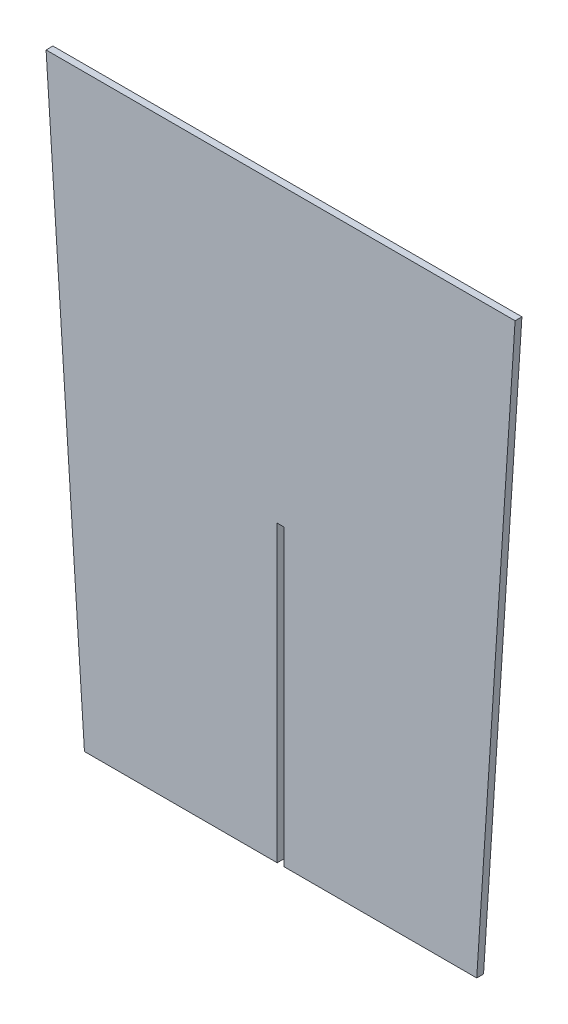
ISO-10303-21;
HEADER;
FILE_DESCRIPTION(('STEP AP214'),'2;1');
FILE_NAME('part.step','',(''),(''),'','','');
FILE_SCHEMA(('AUTOMOTIVE_DESIGN { 1 0 10303 214 1 1 1 1 }'));
ENDSEC;
DATA;
#1=APPLICATION_CONTEXT('core data for automotive mechanical design processes');
#2=APPLICATION_PROTOCOL_DEFINITION('international standard','automotive_design',2000,#1);
#3=PRODUCT_CONTEXT('',#1,'mechanical');
#4=PRODUCT('Part','Part','',(#3));
#5=PRODUCT_RELATED_PRODUCT_CATEGORY('part','',(#4));
#6=PRODUCT_DEFINITION_FORMATION('','',#4);
#7=PRODUCT_DEFINITION_CONTEXT('part definition',#1,'design');
#8=PRODUCT_DEFINITION('design','',#6,#7);
#9=PRODUCT_DEFINITION_SHAPE('','',#8);
#10=(LENGTH_UNIT() NAMED_UNIT(*) SI_UNIT(.MILLI.,.METRE.));
#11=(NAMED_UNIT(*) PLANE_ANGLE_UNIT() SI_UNIT($,.RADIAN.));
#12=(NAMED_UNIT(*) SI_UNIT($,.STERADIAN.) SOLID_ANGLE_UNIT());
#13=UNCERTAINTY_MEASURE_WITH_UNIT(LENGTH_MEASURE(1.E-05),#10,'distance_accuracy_value','');
#14=(GEOMETRIC_REPRESENTATION_CONTEXT(3) GLOBAL_UNCERTAINTY_ASSIGNED_CONTEXT((#13)) GLOBAL_UNIT_ASSIGNED_CONTEXT((#10,
#11,#12)) REPRESENTATION_CONTEXT('',''));
#15=CARTESIAN_POINT('',(0.,0.,0.));
#16=DIRECTION('',(0.,0.,1.));
#17=DIRECTION('',(1.,0.,0.));
#18=AXIS2_PLACEMENT_3D('',#15,#16,#17);
#19=CARTESIAN_POINT('',(0.,172.5,4.));
#20=DIRECTION('',(0.,1.,0.));
#21=DIRECTION('',(0.,0.,1.));
#22=AXIS2_PLACEMENT_3D('',#19,#20,#21);
#23=PLANE('',#22);
#24=DIRECTION('',(1.,0.,0.));
#25=VECTOR('',#24,1.);
#26=CARTESIAN_POINT('',(0.,172.5,0.));
#27=LINE('',#26,#25);
#28=CARTESIAN_POINT('',(113.,172.5,0.));
#29=VERTEX_POINT('',#28);
#30=CARTESIAN_POINT('',(117.,172.5,0.));
#31=VERTEX_POINT('',#30);
#32=EDGE_CURVE('E138',#29,#31,#27,.T.);
#33=ORIENTED_EDGE('',*,*,#32,.T.);
#34=DIRECTION('',(0.,0.,-1.));
#35=VECTOR('',#34,1.);
#36=CARTESIAN_POINT('',(117.,172.5,4.));
#37=LINE('',#36,#35);
#38=CARTESIAN_POINT('',(117.,172.5,4.));
#39=VERTEX_POINT('',#38);
#40=EDGE_CURVE('E11',#39,#31,#37,.T.);
#41=ORIENTED_EDGE('',*,*,#40,.F.);
#42=DIRECTION('',(1.,0.,0.));
#43=VECTOR('',#42,1.);
#44=CARTESIAN_POINT('',(0.,172.5,4.));
#45=LINE('',#44,#43);
#46=CARTESIAN_POINT('',(113.,172.5,4.));
#47=VERTEX_POINT('',#46);
#48=EDGE_CURVE('E154',#47,#39,#45,.T.);
#49=ORIENTED_EDGE('',*,*,#48,.F.);
#50=DIRECTION('',(0.,0.,-1.));
#51=VECTOR('',#50,1.);
#52=CARTESIAN_POINT('',(113.,172.5,4.));
#53=LINE('',#52,#51);
#54=EDGE_CURVE('E134',#47,#29,#53,.T.);
#55=ORIENTED_EDGE('',*,*,#54,.T.);
#56=EDGE_LOOP('',(#33,#41,#49,#55));
#57=FACE_BOUND('',#56,.T.);
#58=ADVANCED_FACE('F41',(#57),#23,.F.);
#59=CARTESIAN_POINT('',(117.,0.,4.));
#60=DIRECTION('',(1.,0.,0.));
#61=DIRECTION('',(0.,1.,0.));
#62=AXIS2_PLACEMENT_3D('',#59,#60,#61);
#63=PLANE('',#62);
#64=DIRECTION('',(0.,-1.,0.));
#65=VECTOR('',#64,1.);
#66=CARTESIAN_POINT('',(117.,0.,0.));
#67=LINE('',#66,#65);
#68=CARTESIAN_POINT('',(117.,0.,0.));
#69=VERTEX_POINT('',#68);
#70=EDGE_CURVE('E141',#31,#69,#67,.T.);
#71=ORIENTED_EDGE('',*,*,#70,.T.);
#72=DIRECTION('',(0.,0.,-1.));
#73=VECTOR('',#72,1.);
#74=CARTESIAN_POINT('',(117.,0.,4.));
#75=LINE('',#74,#73);
#76=CARTESIAN_POINT('',(117.,0.,4.));
#77=VERTEX_POINT('',#76);
#78=EDGE_CURVE('E49',#77,#69,#75,.T.);
#79=ORIENTED_EDGE('',*,*,#78,.F.);
#80=DIRECTION('',(0.,-1.,0.));
#81=VECTOR('',#80,1.);
#82=CARTESIAN_POINT('',(117.,0.,4.));
#83=LINE('',#82,#81);
#84=EDGE_CURVE('E100',#39,#77,#83,.T.);
#85=ORIENTED_EDGE('',*,*,#84,.F.);
#86=ORIENTED_EDGE('',*,*,#40,.T.);
#87=EDGE_LOOP('',(#71,#79,#85,#86));
#88=FACE_BOUND('',#87,.T.);
#89=ADVANCED_FACE('F184',(#88),#63,.F.);
#90=CARTESIAN_POINT('',(0.,0.,4.));
#91=DIRECTION('',(0.,1.,0.));
#92=DIRECTION('',(0.,0.,1.));
#93=AXIS2_PLACEMENT_3D('',#90,#91,#92);
#94=PLANE('',#93);
#95=DIRECTION('',(1.,0.,0.));
#96=VECTOR('',#95,1.);
#97=CARTESIAN_POINT('',(0.,0.,0.));
#98=LINE('',#97,#96);
#99=CARTESIAN_POINT('',(230.,0.,0.));
#100=VERTEX_POINT('',#99);
#101=EDGE_CURVE('E143',#69,#100,#98,.T.);
#102=ORIENTED_EDGE('',*,*,#101,.T.);
#103=DIRECTION('',(0.,0.,-1.));
#104=VECTOR('',#103,1.);
#105=CARTESIAN_POINT('',(230.,0.,4.));
#106=LINE('',#105,#104);
#107=CARTESIAN_POINT('',(230.,0.,4.));
#108=VERTEX_POINT('',#107);
#109=EDGE_CURVE('E160',#108,#100,#106,.T.);
#110=ORIENTED_EDGE('',*,*,#109,.F.);
#111=DIRECTION('',(1.,0.,0.));
#112=VECTOR('',#111,1.);
#113=CARTESIAN_POINT('',(0.,0.,4.));
#114=LINE('',#113,#112);
#115=EDGE_CURVE('E167',#77,#108,#114,.T.);
#116=ORIENTED_EDGE('',*,*,#115,.F.);
#117=ORIENTED_EDGE('',*,*,#78,.T.);
#118=EDGE_LOOP('',(#102,#110,#116,#117));
#119=FACE_BOUND('',#118,.T.);
#120=ADVANCED_FACE('F165',(#119),#94,.F.);
#121=CARTESIAN_POINT('',(229.025882352941,-14.9364705882353,4.));
#122=DIRECTION('',(0.997880105965818,-0.0650791373455969,0.));
#123=DIRECTION('',(0.0650791373455969,0.997880105965818,0.));
#124=AXIS2_PLACEMENT_3D('',#121,#122,#123);
#125=PLANE('',#124);
#126=DIRECTION('',(-0.0650791373455969,-0.997880105965818,0.));
#127=VECTOR('',#126,1.);
#128=CARTESIAN_POINT('',(229.025882352941,-14.9364705882353,0.));
#129=LINE('',#128,#127);
#130=CARTESIAN_POINT('',(252.5,345.,0.));
#131=VERTEX_POINT('',#130);
#132=EDGE_CURVE('E146',#131,#100,#129,.T.);
#133=ORIENTED_EDGE('',*,*,#132,.F.);
#134=DIRECTION('',(0.,0.,-1.));
#135=VECTOR('',#134,1.);
#136=CARTESIAN_POINT('',(252.5,345.,4.));
#137=LINE('',#136,#135);
#138=CARTESIAN_POINT('',(252.5,345.,4.));
#139=VERTEX_POINT('',#138);
#140=EDGE_CURVE('E158',#139,#131,#137,.T.);
#141=ORIENTED_EDGE('',*,*,#140,.F.);
#142=DIRECTION('',(-0.0650791373455969,-0.997880105965818,0.));
#143=VECTOR('',#142,1.);
#144=CARTESIAN_POINT('',(229.025882352941,-14.9364705882353,4.));
#145=LINE('',#144,#143);
#146=EDGE_CURVE('E176',#139,#108,#145,.T.);
#147=ORIENTED_EDGE('',*,*,#146,.T.);
#148=ORIENTED_EDGE('',*,*,#109,.T.);
#149=EDGE_LOOP('',(#133,#141,#147,#148));
#150=FACE_BOUND('',#149,.T.);
#151=ADVANCED_FACE('F174',(#150),#125,.T.);
#152=CARTESIAN_POINT('',(0.,345.,4.));
#153=DIRECTION('',(0.,-1.,0.));
#154=DIRECTION('',(0.,0.,-1.));
#155=AXIS2_PLACEMENT_3D('',#152,#153,#154);
#156=PLANE('',#155);
#157=DIRECTION('',(-1.,0.,0.));
#158=VECTOR('',#157,1.);
#159=CARTESIAN_POINT('',(0.,345.,0.));
#160=LINE('',#159,#158);
#161=CARTESIAN_POINT('',(-22.5,345.,0.));
#162=VERTEX_POINT('',#161);
#163=EDGE_CURVE('E149',#131,#162,#160,.T.);
#164=ORIENTED_EDGE('',*,*,#163,.T.);
#165=DIRECTION('',(0.,0.,-1.));
#166=VECTOR('',#165,1.);
#167=CARTESIAN_POINT('',(-22.5,345.,4.));
#168=LINE('',#167,#166);
#169=CARTESIAN_POINT('',(-22.5,345.,4.));
#170=VERTEX_POINT('',#169);
#171=EDGE_CURVE('E129',#170,#162,#168,.T.);
#172=ORIENTED_EDGE('',*,*,#171,.F.);
#173=DIRECTION('',(-1.,0.,0.));
#174=VECTOR('',#173,1.);
#175=CARTESIAN_POINT('',(0.,345.,4.));
#176=LINE('',#175,#174);
#177=EDGE_CURVE('E120',#139,#170,#176,.T.);
#178=ORIENTED_EDGE('',*,*,#177,.F.);
#179=ORIENTED_EDGE('',*,*,#140,.T.);
#180=EDGE_LOOP('',(#164,#172,#178,#179));
#181=FACE_BOUND('',#180,.T.);
#182=ADVANCED_FACE('F194',(#181),#156,.F.);
#183=CARTESIAN_POINT('',(0.,0.,4.));
#184=DIRECTION('',(0.997880105965818,0.0650791373455968,0.));
#185=DIRECTION('',(-0.0650791373455968,0.997880105965818,0.));
#186=AXIS2_PLACEMENT_3D('',#183,#184,#185);
#187=PLANE('',#186);
#188=DIRECTION('',(0.0650791373455968,-0.997880105965818,0.));
#189=VECTOR('',#188,1.);
#190=CARTESIAN_POINT('',(0.,0.,0.));
#191=LINE('',#190,#189);
#192=CARTESIAN_POINT('',(0.,0.,0.));
#193=VERTEX_POINT('',#192);
#194=EDGE_CURVE('E128',#162,#193,#191,.T.);
#195=ORIENTED_EDGE('',*,*,#194,.T.);
#196=DIRECTION('',(0.,0.,-1.));
#197=VECTOR('',#196,1.);
#198=CARTESIAN_POINT('',(0.,0.,4.));
#199=LINE('',#198,#197);
#200=CARTESIAN_POINT('',(0.,0.,4.));
#201=VERTEX_POINT('',#200);
#202=EDGE_CURVE('E125',#201,#193,#199,.T.);
#203=ORIENTED_EDGE('',*,*,#202,.F.);
#204=DIRECTION('',(0.0650791373455968,-0.997880105965818,0.));
#205=VECTOR('',#204,1.);
#206=CARTESIAN_POINT('',(0.,0.,4.));
#207=LINE('',#206,#205);
#208=EDGE_CURVE('E113',#170,#201,#207,.T.);
#209=ORIENTED_EDGE('',*,*,#208,.F.);
#210=ORIENTED_EDGE('',*,*,#171,.T.);
#211=EDGE_LOOP('',(#195,#203,#209,#210));
#212=FACE_BOUND('',#211,.T.);
#213=ADVANCED_FACE('F126',(#212),#187,.F.);
#214=CARTESIAN_POINT('',(0.,0.,4.));
#215=DIRECTION('',(0.,1.,0.));
#216=DIRECTION('',(0.,0.,1.));
#217=AXIS2_PLACEMENT_3D('',#214,#215,#216);
#218=PLANE('',#217);
#219=DIRECTION('',(1.,0.,0.));
#220=VECTOR('',#219,1.);
#221=CARTESIAN_POINT('',(0.,0.,0.));
#222=LINE('',#221,#220);
#223=CARTESIAN_POINT('',(113.,0.,0.));
#224=VERTEX_POINT('',#223);
#225=EDGE_CURVE('E86',#193,#224,#222,.T.);
#226=ORIENTED_EDGE('',*,*,#225,.T.);
#227=DIRECTION('',(0.,0.,-1.));
#228=VECTOR('',#227,1.);
#229=CARTESIAN_POINT('',(113.,0.,4.));
#230=LINE('',#229,#228);
#231=CARTESIAN_POINT('',(113.,0.,4.));
#232=VERTEX_POINT('',#231);
#233=EDGE_CURVE('E130',#232,#224,#230,.T.);
#234=ORIENTED_EDGE('',*,*,#233,.F.);
#235=DIRECTION('',(1.,0.,0.));
#236=VECTOR('',#235,1.);
#237=CARTESIAN_POINT('',(0.,0.,4.));
#238=LINE('',#237,#236);
#239=EDGE_CURVE('E117',#201,#232,#238,.T.);
#240=ORIENTED_EDGE('',*,*,#239,.F.);
#241=ORIENTED_EDGE('',*,*,#202,.T.);
#242=EDGE_LOOP('',(#226,#234,#240,#241));
#243=FACE_BOUND('',#242,.T.);
#244=ADVANCED_FACE('F132',(#243),#218,.F.);
#245=CARTESIAN_POINT('',(113.,0.,4.));
#246=DIRECTION('',(-1.,0.,0.));
#247=DIRECTION('',(0.,0.,1.));
#248=AXIS2_PLACEMENT_3D('',#245,#246,#247);
#249=PLANE('',#248);
#250=DIRECTION('',(0.,1.,0.));
#251=VECTOR('',#250,1.);
#252=CARTESIAN_POINT('',(113.,0.,0.));
#253=LINE('',#252,#251);
#254=EDGE_CURVE('E92',#224,#29,#253,.T.);
#255=ORIENTED_EDGE('',*,*,#254,.T.);
#256=ORIENTED_EDGE('',*,*,#54,.F.);
#257=DIRECTION('',(0.,1.,0.));
#258=VECTOR('',#257,1.);
#259=CARTESIAN_POINT('',(113.,0.,4.));
#260=LINE('',#259,#258);
#261=EDGE_CURVE('E57',#232,#47,#260,.T.);
#262=ORIENTED_EDGE('',*,*,#261,.F.);
#263=ORIENTED_EDGE('',*,*,#233,.T.);
#264=EDGE_LOOP('',(#255,#256,#262,#263));
#265=FACE_BOUND('',#264,.T.);
#266=ADVANCED_FACE('F202',(#265),#249,.F.);
#267=CARTESIAN_POINT('',(0.,0.,4.));
#268=DIRECTION('',(0.,0.,1.));
#269=DIRECTION('',(1.,0.,0.));
#270=AXIS2_PLACEMENT_3D('',#267,#268,#269);
#271=PLANE('',#270);
#272=ORIENTED_EDGE('',*,*,#48,.T.);
#273=ORIENTED_EDGE('',*,*,#84,.T.);
#274=ORIENTED_EDGE('',*,*,#115,.T.);
#275=ORIENTED_EDGE('',*,*,#146,.F.);
#276=ORIENTED_EDGE('',*,*,#177,.T.);
#277=ORIENTED_EDGE('',*,*,#208,.T.);
#278=ORIENTED_EDGE('',*,*,#239,.T.);
#279=ORIENTED_EDGE('',*,*,#261,.T.);
#280=EDGE_LOOP('',(#272,#273,#274,#275,#276,#277,#278,#279));
#281=FACE_BOUND('',#280,.T.);
#282=ADVANCED_FACE('F115',(#281),#271,.T.);
#283=CARTESIAN_POINT('',(0.,0.,0.));
#284=DIRECTION('',(0.,0.,1.));
#285=DIRECTION('',(1.,0.,0.));
#286=AXIS2_PLACEMENT_3D('',#283,#284,#285);
#287=PLANE('',#286);
#288=ORIENTED_EDGE('',*,*,#32,.F.);
#289=ORIENTED_EDGE('',*,*,#254,.F.);
#290=ORIENTED_EDGE('',*,*,#225,.F.);
#291=ORIENTED_EDGE('',*,*,#194,.F.);
#292=ORIENTED_EDGE('',*,*,#163,.F.);
#293=ORIENTED_EDGE('',*,*,#132,.T.);
#294=ORIENTED_EDGE('',*,*,#101,.F.);
#295=ORIENTED_EDGE('',*,*,#70,.F.);
#296=EDGE_LOOP('',(#288,#289,#290,#291,#292,#293,#294,#295));
#297=FACE_BOUND('',#296,.T.);
#298=ADVANCED_FACE('F170',(#297),#287,.F.);
#299=CLOSED_SHELL('',(#58,#89,#120,#151,#182,#213,#244,#266,#282,#298));
#300=MANIFOLD_SOLID_BREP('B2',#299);
#301=ADVANCED_BREP_SHAPE_REPRESENTATION('',(#18,#300),#14);
#302=SHAPE_DEFINITION_REPRESENTATION(#9,#301);
ENDSEC;
END-ISO-10303-21;
